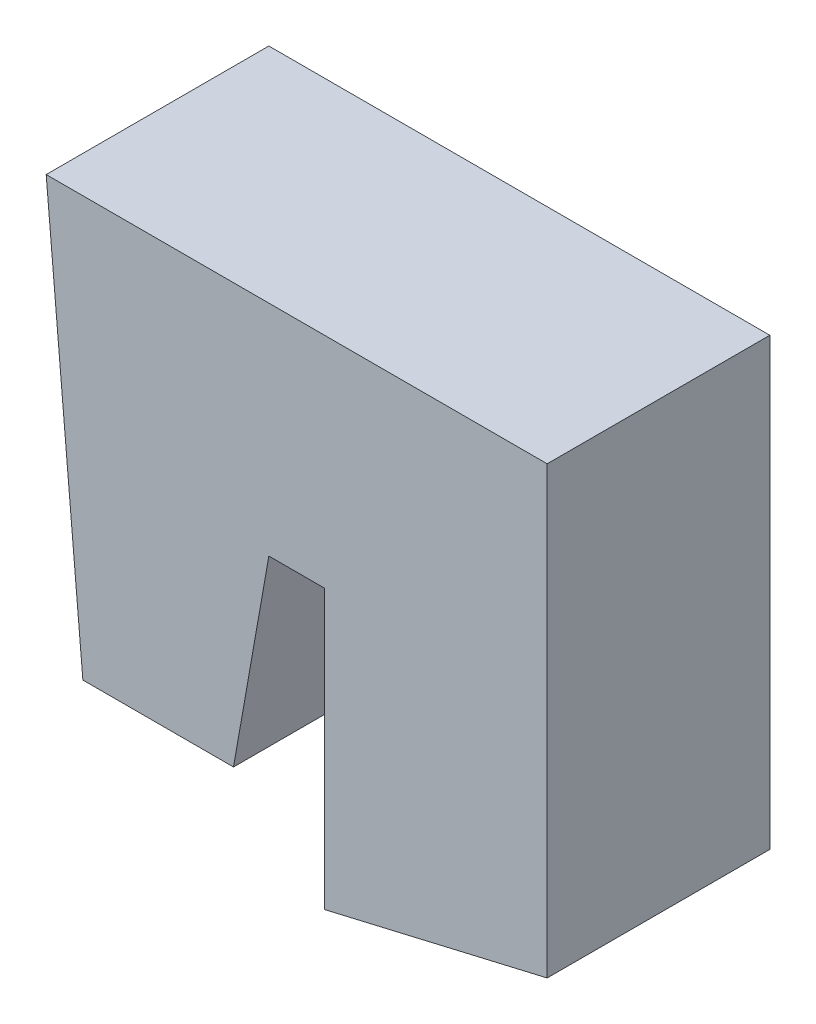
ISO-10303-21;
HEADER;
FILE_DESCRIPTION(('STEP AP214'),'2;1');
FILE_NAME('part.step','',(''),(''),'','','');
FILE_SCHEMA(('AUTOMOTIVE_DESIGN { 1 0 10303 214 1 1 1 1 }'));
ENDSEC;
DATA;
#1=APPLICATION_CONTEXT('core data for automotive mechanical design processes');
#2=APPLICATION_PROTOCOL_DEFINITION('international standard','automotive_design',2000,#1);
#3=PRODUCT_CONTEXT('',#1,'mechanical');
#4=PRODUCT('Part','Part','',(#3));
#5=PRODUCT_RELATED_PRODUCT_CATEGORY('part','',(#4));
#6=PRODUCT_DEFINITION_FORMATION('','',#4);
#7=PRODUCT_DEFINITION_CONTEXT('part definition',#1,'design');
#8=PRODUCT_DEFINITION('design','',#6,#7);
#9=PRODUCT_DEFINITION_SHAPE('','',#8);
#10=(LENGTH_UNIT() NAMED_UNIT(*) SI_UNIT(.MILLI.,.METRE.));
#11=(NAMED_UNIT(*) PLANE_ANGLE_UNIT() SI_UNIT($,.RADIAN.));
#12=(NAMED_UNIT(*) SI_UNIT($,.STERADIAN.) SOLID_ANGLE_UNIT());
#13=UNCERTAINTY_MEASURE_WITH_UNIT(LENGTH_MEASURE(1.E-05),#10,'distance_accuracy_value','');
#14=(GEOMETRIC_REPRESENTATION_CONTEXT(3) GLOBAL_UNCERTAINTY_ASSIGNED_CONTEXT((#13)) GLOBAL_UNIT_ASSIGNED_CONTEXT((#10,
#11,#12)) REPRESENTATION_CONTEXT('',''));
#15=CARTESIAN_POINT('',(0.,0.,0.));
#16=DIRECTION('',(0.,0.,1.));
#17=DIRECTION('',(1.,0.,0.));
#18=AXIS2_PLACEMENT_3D('',#15,#16,#17);
#19=CARTESIAN_POINT('',(22.5,-17.6623376623377,-20.));
#20=DIRECTION('',(1.,0.,0.));
#21=DIRECTION('',(0.,0.,-1.));
#22=AXIS2_PLACEMENT_3D('',#19,#20,#21);
#23=PLANE('',#22);
#24=DIRECTION('',(0.,1.,0.));
#25=VECTOR('',#24,1.);
#26=CARTESIAN_POINT('',(22.5,-17.6623376623377,0.));
#27=LINE('',#26,#25);
#28=CARTESIAN_POINT('',(22.5,-17.6623376623377,0.));
#29=VERTEX_POINT('',#28);
#30=CARTESIAN_POINT('',(22.5,22.3376623376623,0.));
#31=VERTEX_POINT('',#30);
#32=EDGE_CURVE('E129',#29,#31,#27,.T.);
#33=ORIENTED_EDGE('',*,*,#32,.F.);
#34=DIRECTION('',(0.,0.,1.));
#35=VECTOR('',#34,1.);
#36=CARTESIAN_POINT('',(22.5,-17.6623376623377,-20.));
#37=LINE('',#36,#35);
#38=CARTESIAN_POINT('',(22.5,-17.6623376623377,-20.));
#39=VERTEX_POINT('',#38);
#40=EDGE_CURVE('E11',#39,#29,#37,.T.);
#41=ORIENTED_EDGE('',*,*,#40,.F.);
#42=DIRECTION('',(0.,1.,0.));
#43=VECTOR('',#42,1.);
#44=CARTESIAN_POINT('',(22.5,-17.6623376623377,-20.));
#45=LINE('',#44,#43);
#46=CARTESIAN_POINT('',(22.5,22.3376623376623,-20.));
#47=VERTEX_POINT('',#46);
#48=EDGE_CURVE('E149',#39,#47,#45,.T.);
#49=ORIENTED_EDGE('',*,*,#48,.T.);
#50=DIRECTION('',(0.,0.,1.));
#51=VECTOR('',#50,1.);
#52=CARTESIAN_POINT('',(22.5,22.3376623376623,-20.));
#53=LINE('',#52,#51);
#54=EDGE_CURVE('E35',#47,#31,#53,.T.);
#55=ORIENTED_EDGE('',*,*,#54,.T.);
#56=EDGE_LOOP('',(#33,#41,#49,#55));
#57=FACE_BOUND('',#56,.T.);
#58=ADVANCED_FACE('F32',(#57),#23,.T.);
#59=CARTESIAN_POINT('',(2.49999999999999,-22.3376623376623,-20.));
#60=DIRECTION('',(0.227629367038187,-0.973747847885578,0.));
#61=DIRECTION('',(0.973747847885578,0.227629367038187,0.));
#62=AXIS2_PLACEMENT_3D('',#59,#60,#61);
#63=PLANE('',#62);
#64=DIRECTION('',(0.973747847885578,0.227629367038187,0.));
#65=VECTOR('',#64,1.);
#66=CARTESIAN_POINT('',(2.49999999999999,-22.3376623376623,0.));
#67=LINE('',#66,#65);
#68=CARTESIAN_POINT('',(2.49999999999999,-22.3376623376623,0.));
#69=VERTEX_POINT('',#68);
#70=EDGE_CURVE('E147',#69,#29,#67,.T.);
#71=ORIENTED_EDGE('',*,*,#70,.F.);
#72=DIRECTION('',(0.,0.,1.));
#73=VECTOR('',#72,1.);
#74=CARTESIAN_POINT('',(2.49999999999999,-22.3376623376623,-20.));
#75=LINE('',#74,#73);
#76=CARTESIAN_POINT('',(2.49999999999999,-22.3376623376623,-20.));
#77=VERTEX_POINT('',#76);
#78=EDGE_CURVE('E41',#77,#69,#75,.T.);
#79=ORIENTED_EDGE('',*,*,#78,.F.);
#80=DIRECTION('',(0.973747847885578,0.227629367038187,0.));
#81=VECTOR('',#80,1.);
#82=CARTESIAN_POINT('',(2.49999999999999,-22.3376623376623,-20.));
#83=LINE('',#82,#81);
#84=EDGE_CURVE('E119',#77,#39,#83,.T.);
#85=ORIENTED_EDGE('',*,*,#84,.T.);
#86=ORIENTED_EDGE('',*,*,#40,.T.);
#87=EDGE_LOOP('',(#71,#79,#85,#86));
#88=FACE_BOUND('',#87,.T.);
#89=ADVANCED_FACE('F161',(#88),#63,.T.);
#90=CARTESIAN_POINT('',(2.49999999999999,-22.3376623376623,-20.));
#91=DIRECTION('',(-1.,0.,0.));
#92=DIRECTION('',(0.,-1.,0.));
#93=AXIS2_PLACEMENT_3D('',#90,#91,#92);
#94=PLANE('',#93);
#95=DIRECTION('',(0.,-1.,0.));
#96=VECTOR('',#95,1.);
#97=CARTESIAN_POINT('',(2.49999999999999,-22.3376623376623,0.));
#98=LINE('',#97,#96);
#99=CARTESIAN_POINT('',(2.49999999999998,2.66233766233766,0.));
#100=VERTEX_POINT('',#99);
#101=EDGE_CURVE('E106',#100,#69,#98,.T.);
#102=ORIENTED_EDGE('',*,*,#101,.F.);
#103=DIRECTION('',(0.,0.,1.));
#104=VECTOR('',#103,1.);
#105=CARTESIAN_POINT('',(2.49999999999998,2.66233766233766,-20.));
#106=LINE('',#105,#104);
#107=CARTESIAN_POINT('',(2.49999999999998,2.66233766233766,-20.));
#108=VERTEX_POINT('',#107);
#109=EDGE_CURVE('E101',#108,#100,#106,.T.);
#110=ORIENTED_EDGE('',*,*,#109,.F.);
#111=DIRECTION('',(0.,-1.,0.));
#112=VECTOR('',#111,1.);
#113=CARTESIAN_POINT('',(2.49999999999999,-22.3376623376623,-20.));
#114=LINE('',#113,#112);
#115=EDGE_CURVE('E104',#108,#77,#114,.T.);
#116=ORIENTED_EDGE('',*,*,#115,.T.);
#117=ORIENTED_EDGE('',*,*,#78,.T.);
#118=EDGE_LOOP('',(#102,#110,#116,#117));
#119=FACE_BOUND('',#118,.T.);
#120=ADVANCED_FACE('F103',(#119),#94,.T.);
#121=CARTESIAN_POINT('',(2.49999999999998,2.66233766233766,-20.));
#122=DIRECTION('',(0.,-1.,0.));
#123=DIRECTION('',(0.,0.,-1.));
#124=AXIS2_PLACEMENT_3D('',#121,#122,#123);
#125=PLANE('',#124);
#126=DIRECTION('',(1.,0.,0.));
#127=VECTOR('',#126,1.);
#128=CARTESIAN_POINT('',(2.49999999999998,2.66233766233766,0.));
#129=LINE('',#128,#127);
#130=CARTESIAN_POINT('',(-2.50000000000001,2.66233766233766,0.));
#131=VERTEX_POINT('',#130);
#132=EDGE_CURVE('E144',#131,#100,#129,.T.);
#133=ORIENTED_EDGE('',*,*,#132,.F.);
#134=DIRECTION('',(0.,0.,1.));
#135=VECTOR('',#134,1.);
#136=CARTESIAN_POINT('',(-2.50000000000001,2.66233766233766,-20.));
#137=LINE('',#136,#135);
#138=CARTESIAN_POINT('',(-2.50000000000001,2.66233766233766,-20.));
#139=VERTEX_POINT('',#138);
#140=EDGE_CURVE('E111',#139,#131,#137,.T.);
#141=ORIENTED_EDGE('',*,*,#140,.F.);
#142=DIRECTION('',(1.,0.,0.));
#143=VECTOR('',#142,1.);
#144=CARTESIAN_POINT('',(2.49999999999998,2.66233766233766,-20.));
#145=LINE('',#144,#143);
#146=EDGE_CURVE('E117',#139,#108,#145,.T.);
#147=ORIENTED_EDGE('',*,*,#146,.T.);
#148=ORIENTED_EDGE('',*,*,#109,.T.);
#149=EDGE_LOOP('',(#133,#141,#147,#148));
#150=FACE_BOUND('',#149,.T.);
#151=ADVANCED_FACE('F121',(#150),#125,.T.);
#152=CARTESIAN_POINT('',(-2.50000000000001,2.66233766233766,-20.));
#153=DIRECTION('',(0.984807753012209,-0.173648177666927,0.));
#154=DIRECTION('',(0.173648177666927,0.984807753012209,0.));
#155=AXIS2_PLACEMENT_3D('',#152,#153,#154);
#156=PLANE('',#155);
#157=DIRECTION('',(0.173648177666927,0.984807753012209,0.));
#158=VECTOR('',#157,1.);
#159=CARTESIAN_POINT('',(-2.50000000000001,2.66233766233766,0.));
#160=LINE('',#159,#158);
#161=CARTESIAN_POINT('',(-5.67388565275231,-15.3376623376623,0.));
#162=VERTEX_POINT('',#161);
#163=EDGE_CURVE('E141',#162,#131,#160,.T.);
#164=ORIENTED_EDGE('',*,*,#163,.F.);
#165=DIRECTION('',(0.,0.,1.));
#166=VECTOR('',#165,1.);
#167=CARTESIAN_POINT('',(-5.67388565275231,-15.3376623376623,-20.));
#168=LINE('',#167,#166);
#169=CARTESIAN_POINT('',(-5.67388565275231,-15.3376623376623,-20.));
#170=VERTEX_POINT('',#169);
#171=EDGE_CURVE('E153',#170,#162,#168,.T.);
#172=ORIENTED_EDGE('',*,*,#171,.F.);
#173=DIRECTION('',(0.173648177666927,0.984807753012209,0.));
#174=VECTOR('',#173,1.);
#175=CARTESIAN_POINT('',(-2.50000000000001,2.66233766233766,-20.));
#176=LINE('',#175,#174);
#177=EDGE_CURVE('E122',#170,#139,#176,.T.);
#178=ORIENTED_EDGE('',*,*,#177,.T.);
#179=ORIENTED_EDGE('',*,*,#140,.T.);
#180=EDGE_LOOP('',(#164,#172,#178,#179));
#181=FACE_BOUND('',#180,.T.);
#182=ADVANCED_FACE('F174',(#181),#156,.T.);
#183=CARTESIAN_POINT('',(-5.67388565275231,-15.3376623376623,-20.));
#184=DIRECTION('',(0.,-1.,0.));
#185=DIRECTION('',(0.,0.,-1.));
#186=AXIS2_PLACEMENT_3D('',#183,#184,#185);
#187=PLANE('',#186);
#188=DIRECTION('',(1.,0.,0.));
#189=VECTOR('',#188,1.);
#190=CARTESIAN_POINT('',(-5.67388565275231,-15.3376623376623,0.));
#191=LINE('',#190,#189);
#192=CARTESIAN_POINT('',(-19.2038361962504,-15.3376623376623,0.));
#193=VERTEX_POINT('',#192);
#194=EDGE_CURVE('E138',#193,#162,#191,.T.);
#195=ORIENTED_EDGE('',*,*,#194,.F.);
#196=DIRECTION('',(0.,0.,1.));
#197=VECTOR('',#196,1.);
#198=CARTESIAN_POINT('',(-19.2038361962504,-15.3376623376623,-20.));
#199=LINE('',#198,#197);
#200=CARTESIAN_POINT('',(-19.2038361962504,-15.3376623376623,-20.));
#201=VERTEX_POINT('',#200);
#202=EDGE_CURVE('E155',#201,#193,#199,.T.);
#203=ORIENTED_EDGE('',*,*,#202,.F.);
#204=DIRECTION('',(1.,0.,0.));
#205=VECTOR('',#204,1.);
#206=CARTESIAN_POINT('',(-5.67388565275231,-15.3376623376623,-20.));
#207=LINE('',#206,#205);
#208=EDGE_CURVE('E124',#201,#170,#207,.T.);
#209=ORIENTED_EDGE('',*,*,#208,.T.);
#210=ORIENTED_EDGE('',*,*,#171,.T.);
#211=EDGE_LOOP('',(#195,#203,#209,#210));
#212=FACE_BOUND('',#211,.T.);
#213=ADVANCED_FACE('F177',(#212),#187,.T.);
#214=CARTESIAN_POINT('',(-22.5,22.3376623376623,-20.));
#215=DIRECTION('',(-0.996194698091745,-0.087155742747662,0.));
#216=DIRECTION('',(0.087155742747662,-0.996194698091745,0.));
#217=AXIS2_PLACEMENT_3D('',#214,#215,#216);
#218=PLANE('',#217);
#219=DIRECTION('',(0.087155742747662,-0.996194698091745,0.));
#220=VECTOR('',#219,1.);
#221=CARTESIAN_POINT('',(-22.5,22.3376623376623,0.));
#222=LINE('',#221,#220);
#223=CARTESIAN_POINT('',(-22.5,22.3376623376623,0.));
#224=VERTEX_POINT('',#223);
#225=EDGE_CURVE('E135',#224,#193,#222,.T.);
#226=ORIENTED_EDGE('',*,*,#225,.F.);
#227=DIRECTION('',(0.,0.,1.));
#228=VECTOR('',#227,1.);
#229=CARTESIAN_POINT('',(-22.5,22.3376623376623,-20.));
#230=LINE('',#229,#228);
#231=CARTESIAN_POINT('',(-22.5,22.3376623376623,-20.));
#232=VERTEX_POINT('',#231);
#233=EDGE_CURVE('E156',#232,#224,#230,.T.);
#234=ORIENTED_EDGE('',*,*,#233,.F.);
#235=DIRECTION('',(0.087155742747662,-0.996194698091745,0.));
#236=VECTOR('',#235,1.);
#237=CARTESIAN_POINT('',(-22.5,22.3376623376623,-20.));
#238=LINE('',#237,#236);
#239=EDGE_CURVE('E252',#232,#201,#238,.T.);
#240=ORIENTED_EDGE('',*,*,#239,.T.);
#241=ORIENTED_EDGE('',*,*,#202,.T.);
#242=EDGE_LOOP('',(#226,#234,#240,#241));
#243=FACE_BOUND('',#242,.T.);
#244=ADVANCED_FACE('F181',(#243),#218,.T.);
#245=CARTESIAN_POINT('',(22.5,22.3376623376623,-20.));
#246=DIRECTION('',(0.,1.,0.));
#247=DIRECTION('',(-1.,0.,0.));
#248=AXIS2_PLACEMENT_3D('',#245,#246,#247);
#249=PLANE('',#248);
#250=DIRECTION('',(-1.,0.,0.));
#251=VECTOR('',#250,1.);
#252=CARTESIAN_POINT('',(22.5,22.3376623376623,0.));
#253=LINE('',#252,#251);
#254=EDGE_CURVE('E132',#31,#224,#253,.T.);
#255=ORIENTED_EDGE('',*,*,#254,.F.);
#256=ORIENTED_EDGE('',*,*,#54,.F.);
#257=DIRECTION('',(-1.,0.,0.));
#258=VECTOR('',#257,1.);
#259=CARTESIAN_POINT('',(22.5,22.3376623376623,-20.));
#260=LINE('',#259,#258);
#261=EDGE_CURVE('E253',#47,#232,#260,.T.);
#262=ORIENTED_EDGE('',*,*,#261,.T.);
#263=ORIENTED_EDGE('',*,*,#233,.T.);
#264=EDGE_LOOP('',(#255,#256,#262,#263));
#265=FACE_BOUND('',#264,.T.);
#266=ADVANCED_FACE('F158',(#265),#249,.T.);
#267=CARTESIAN_POINT('',(0.,0.,-20.));
#268=DIRECTION('',(0.,0.,1.));
#269=DIRECTION('',(1.,0.,0.));
#270=AXIS2_PLACEMENT_3D('',#267,#268,#269);
#271=PLANE('',#270);
#272=ORIENTED_EDGE('',*,*,#48,.F.);
#273=ORIENTED_EDGE('',*,*,#84,.F.);
#274=ORIENTED_EDGE('',*,*,#115,.F.);
#275=ORIENTED_EDGE('',*,*,#146,.F.);
#276=ORIENTED_EDGE('',*,*,#177,.F.);
#277=ORIENTED_EDGE('',*,*,#208,.F.);
#278=ORIENTED_EDGE('',*,*,#239,.F.);
#279=ORIENTED_EDGE('',*,*,#261,.F.);
#280=EDGE_LOOP('',(#272,#273,#274,#275,#276,#277,#278,#279));
#281=FACE_BOUND('',#280,.T.);
#282=ADVANCED_FACE('F115',(#281),#271,.F.);
#283=CARTESIAN_POINT('',(0.,0.,0.));
#284=DIRECTION('',(0.,0.,1.));
#285=DIRECTION('',(1.,0.,0.));
#286=AXIS2_PLACEMENT_3D('',#283,#284,#285);
#287=PLANE('',#286);
#288=ORIENTED_EDGE('',*,*,#32,.T.);
#289=ORIENTED_EDGE('',*,*,#254,.T.);
#290=ORIENTED_EDGE('',*,*,#225,.T.);
#291=ORIENTED_EDGE('',*,*,#194,.T.);
#292=ORIENTED_EDGE('',*,*,#163,.T.);
#293=ORIENTED_EDGE('',*,*,#132,.T.);
#294=ORIENTED_EDGE('',*,*,#101,.T.);
#295=ORIENTED_EDGE('',*,*,#70,.T.);
#296=EDGE_LOOP('',(#288,#289,#290,#291,#292,#293,#294,#295));
#297=FACE_BOUND('',#296,.T.);
#298=ADVANCED_FACE('F160',(#297),#287,.T.);
#299=CLOSED_SHELL('',(#58,#89,#120,#151,#182,#213,#244,#266,#282,#298));
#300=MANIFOLD_SOLID_BREP('B2',#299);
#301=ADVANCED_BREP_SHAPE_REPRESENTATION('',(#18,#300),#14);
#302=SHAPE_DEFINITION_REPRESENTATION(#9,#301);
ENDSEC;
END-ISO-10303-21;
